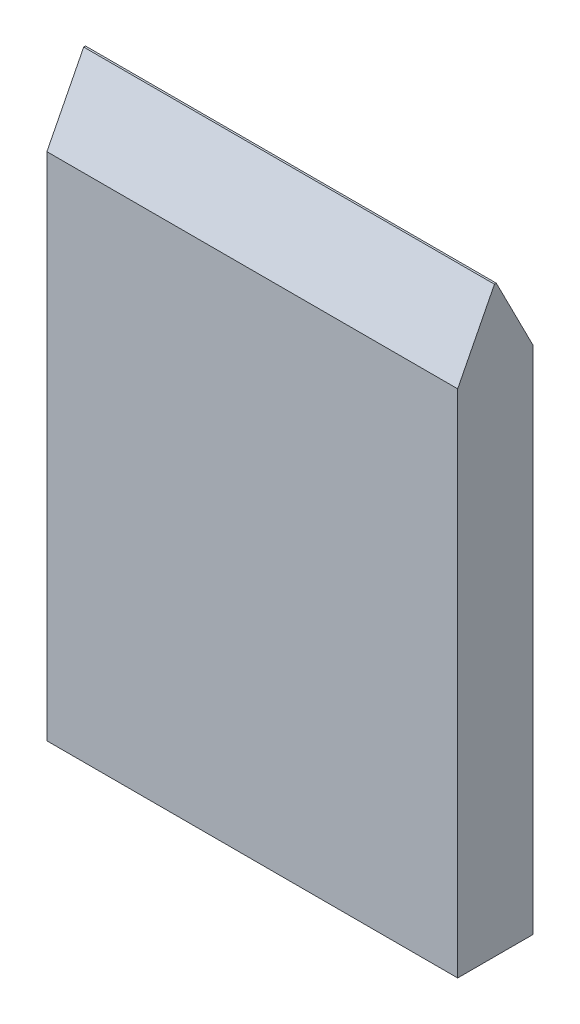
ISO-10303-21;
HEADER;
FILE_DESCRIPTION(('STEP AP214'),'2;1');
FILE_NAME('part.step','',(''),(''),'','','');
FILE_SCHEMA(('AUTOMOTIVE_DESIGN { 1 0 10303 214 1 1 1 1 }'));
ENDSEC;
DATA;
#1=APPLICATION_CONTEXT('core data for automotive mechanical design processes');
#2=APPLICATION_PROTOCOL_DEFINITION('international standard','automotive_design',2000,#1);
#3=PRODUCT_CONTEXT('',#1,'mechanical');
#4=PRODUCT('Part','Part','',(#3));
#5=PRODUCT_RELATED_PRODUCT_CATEGORY('part','',(#4));
#6=PRODUCT_DEFINITION_FORMATION('','',#4);
#7=PRODUCT_DEFINITION_CONTEXT('part definition',#1,'design');
#8=PRODUCT_DEFINITION('design','',#6,#7);
#9=PRODUCT_DEFINITION_SHAPE('','',#8);
#10=(LENGTH_UNIT() NAMED_UNIT(*) SI_UNIT(.MILLI.,.METRE.));
#11=(NAMED_UNIT(*) PLANE_ANGLE_UNIT() SI_UNIT($,.RADIAN.));
#12=(NAMED_UNIT(*) SI_UNIT($,.STERADIAN.) SOLID_ANGLE_UNIT());
#13=UNCERTAINTY_MEASURE_WITH_UNIT(LENGTH_MEASURE(1.E-05),#10,'distance_accuracy_value','');
#14=(GEOMETRIC_REPRESENTATION_CONTEXT(3) GLOBAL_UNCERTAINTY_ASSIGNED_CONTEXT((#13)) GLOBAL_UNIT_ASSIGNED_CONTEXT((#10,
#11,#12)) REPRESENTATION_CONTEXT('',''));
#15=CARTESIAN_POINT('',(0.,0.,0.));
#16=DIRECTION('',(0.,0.,1.));
#17=DIRECTION('',(1.,0.,0.));
#18=AXIS2_PLACEMENT_3D('',#15,#16,#17);
#19=CARTESIAN_POINT('',(-3.35,-4.75,1.23));
#20=DIRECTION('',(1.,0.,0.));
#21=DIRECTION('',(0.,0.,-1.));
#22=AXIS2_PLACEMENT_3D('',#19,#20,#21);
#23=PLANE('',#22);
#24=DIRECTION('',(0.,0.,-1.));
#25=VECTOR('',#24,1.);
#26=CARTESIAN_POINT('',(-3.35,4.75,1.23));
#27=LINE('',#26,#25);
#28=CARTESIAN_POINT('',(-3.35,4.75,0.629999999999999));
#29=VERTEX_POINT('',#28);
#30=CARTESIAN_POINT('',(-3.35,4.75,0.600000000000002));
#31=VERTEX_POINT('',#30);
#32=EDGE_CURVE('E171',#29,#31,#27,.T.);
#33=ORIENTED_EDGE('',*,*,#32,.T.);
#34=DIRECTION('',(0.,0.891006524188368,0.453990499739547));
#35=VECTOR('',#34,1.);
#36=CARTESIAN_POINT('',(-3.35,4.75,0.600000000000002));
#37=LINE('',#36,#35);
#38=CARTESIAN_POINT('',(-3.35,3.57243369669691,0.));
#39=VERTEX_POINT('',#38);
#40=EDGE_CURVE('E153',#31,#39,#37,.F.);
#41=ORIENTED_EDGE('',*,*,#40,.T.);
#42=DIRECTION('',(0.,-1.,0.));
#43=VECTOR('',#42,1.);
#44=CARTESIAN_POINT('',(-3.35,-4.75,0.));
#45=LINE('',#44,#43);
#46=CARTESIAN_POINT('',(-3.35,-4.75,0.));
#47=VERTEX_POINT('',#46);
#48=EDGE_CURVE('E133',#39,#47,#45,.T.);
#49=ORIENTED_EDGE('',*,*,#48,.T.);
#50=DIRECTION('',(0.,0.,-1.));
#51=VECTOR('',#50,1.);
#52=CARTESIAN_POINT('',(-3.35,-4.75,1.23));
#53=LINE('',#52,#51);
#54=CARTESIAN_POINT('',(-3.35,-4.75,1.23));
#55=VERTEX_POINT('',#54);
#56=EDGE_CURVE('E126',#55,#47,#53,.T.);
#57=ORIENTED_EDGE('',*,*,#56,.F.);
#58=DIRECTION('',(0.,-1.,0.));
#59=VECTOR('',#58,1.);
#60=CARTESIAN_POINT('',(-3.35,-4.75,1.23));
#61=LINE('',#60,#59);
#62=CARTESIAN_POINT('',(-3.35,3.57243369669691,1.23));
#63=VERTEX_POINT('',#62);
#64=EDGE_CURVE('E112',#63,#55,#61,.T.);
#65=ORIENTED_EDGE('',*,*,#64,.F.);
#66=DIRECTION('',(0.,0.891006524188368,-0.453990499739547));
#67=VECTOR('',#66,1.);
#68=CARTESIAN_POINT('',(-3.35,3.57243369669691,1.23));
#69=LINE('',#68,#67);
#70=EDGE_CURVE('E150',#63,#29,#69,.T.);
#71=ORIENTED_EDGE('',*,*,#70,.T.);
#72=EDGE_LOOP('',(#33,#41,#49,#57,#65,#71));
#73=FACE_BOUND('',#72,.T.);
#74=ADVANCED_FACE('F43',(#73),#23,.F.);
#75=CARTESIAN_POINT('',(3.35,-4.75,1.23));
#76=DIRECTION('',(0.,1.,0.));
#77=DIRECTION('',(-1.,0.,0.));
#78=AXIS2_PLACEMENT_3D('',#75,#76,#77);
#79=PLANE('',#78);
#80=DIRECTION('',(1.,0.,0.));
#81=VECTOR('',#80,1.);
#82=CARTESIAN_POINT('',(3.35,-4.75,0.));
#83=LINE('',#82,#81);
#84=CARTESIAN_POINT('',(3.35,-4.75,0.));
#85=VERTEX_POINT('',#84);
#86=EDGE_CURVE('E174',#47,#85,#83,.T.);
#87=ORIENTED_EDGE('',*,*,#86,.T.);
#88=DIRECTION('',(0.,0.,-1.));
#89=VECTOR('',#88,1.);
#90=CARTESIAN_POINT('',(3.35,-4.75,1.23));
#91=LINE('',#90,#89);
#92=CARTESIAN_POINT('',(3.35,-4.75,1.23));
#93=VERTEX_POINT('',#92);
#94=EDGE_CURVE('E128',#93,#85,#91,.T.);
#95=ORIENTED_EDGE('',*,*,#94,.F.);
#96=DIRECTION('',(1.,0.,0.));
#97=VECTOR('',#96,1.);
#98=CARTESIAN_POINT('',(3.35,-4.75,1.23));
#99=LINE('',#98,#97);
#100=EDGE_CURVE('E115',#55,#93,#99,.T.);
#101=ORIENTED_EDGE('',*,*,#100,.F.);
#102=ORIENTED_EDGE('',*,*,#56,.T.);
#103=EDGE_LOOP('',(#87,#95,#101,#102));
#104=FACE_BOUND('',#103,.T.);
#105=ADVANCED_FACE('F125',(#104),#79,.F.);
#106=CARTESIAN_POINT('',(3.35,-4.75,1.23));
#107=DIRECTION('',(-1.,0.,0.));
#108=DIRECTION('',(0.,0.,1.));
#109=AXIS2_PLACEMENT_3D('',#106,#107,#108);
#110=PLANE('',#109);
#111=DIRECTION('',(0.,1.,0.));
#112=VECTOR('',#111,1.);
#113=CARTESIAN_POINT('',(3.35,-4.75,0.));
#114=LINE('',#113,#112);
#115=CARTESIAN_POINT('',(3.35,3.57243369669691,0.));
#116=VERTEX_POINT('',#115);
#117=EDGE_CURVE('E121',#85,#116,#114,.T.);
#118=ORIENTED_EDGE('',*,*,#117,.T.);
#119=DIRECTION('',(0.,-0.891006524188368,-0.453990499739547));
#120=VECTOR('',#119,1.);
#121=CARTESIAN_POINT('',(3.35,4.75,0.600000000000002));
#122=LINE('',#121,#120);
#123=CARTESIAN_POINT('',(3.35,4.75,0.600000000000002));
#124=VERTEX_POINT('',#123);
#125=EDGE_CURVE('E52',#116,#124,#122,.F.);
#126=ORIENTED_EDGE('',*,*,#125,.T.);
#127=DIRECTION('',(0.,0.,-1.));
#128=VECTOR('',#127,1.);
#129=CARTESIAN_POINT('',(3.35,4.75,1.23));
#130=LINE('',#129,#128);
#131=CARTESIAN_POINT('',(3.35,4.75,0.629999999999999));
#132=VERTEX_POINT('',#131);
#133=EDGE_CURVE('E143',#132,#124,#130,.T.);
#134=ORIENTED_EDGE('',*,*,#133,.F.);
#135=DIRECTION('',(0.,-0.891006524188368,0.453990499739547));
#136=VECTOR('',#135,1.);
#137=CARTESIAN_POINT('',(3.35,3.57243369669691,1.23));
#138=LINE('',#137,#136);
#139=CARTESIAN_POINT('',(3.35,3.57243369669691,1.23));
#140=VERTEX_POINT('',#139);
#141=EDGE_CURVE('E62',#132,#140,#138,.T.);
#142=ORIENTED_EDGE('',*,*,#141,.T.);
#143=DIRECTION('',(0.,1.,0.));
#144=VECTOR('',#143,1.);
#145=CARTESIAN_POINT('',(3.35,-4.75,1.23));
#146=LINE('',#145,#144);
#147=EDGE_CURVE('E130',#93,#140,#146,.T.);
#148=ORIENTED_EDGE('',*,*,#147,.F.);
#149=ORIENTED_EDGE('',*,*,#94,.T.);
#150=EDGE_LOOP('',(#118,#126,#134,#142,#148,#149));
#151=FACE_BOUND('',#150,.T.);
#152=ADVANCED_FACE('F163',(#151),#110,.F.);
#153=CARTESIAN_POINT('',(3.35,4.75,1.23));
#154=DIRECTION('',(0.,-1.,0.));
#155=DIRECTION('',(1.,0.,0.));
#156=AXIS2_PLACEMENT_3D('',#153,#154,#155);
#157=PLANE('',#156);
#158=ORIENTED_EDGE('',*,*,#133,.T.);
#159=DIRECTION('',(-1.,0.,0.));
#160=VECTOR('',#159,1.);
#161=CARTESIAN_POINT('',(3.35,4.75,0.600000000000002));
#162=LINE('',#161,#160);
#163=EDGE_CURVE('E140',#124,#31,#162,.T.);
#164=ORIENTED_EDGE('',*,*,#163,.T.);
#165=ORIENTED_EDGE('',*,*,#32,.F.);
#166=DIRECTION('',(1.,0.,0.));
#167=VECTOR('',#166,1.);
#168=CARTESIAN_POINT('',(3.35,4.75,0.629999999999999));
#169=LINE('',#168,#167);
#170=EDGE_CURVE('E136',#29,#132,#169,.T.);
#171=ORIENTED_EDGE('',*,*,#170,.T.);
#172=EDGE_LOOP('',(#158,#164,#165,#171));
#173=FACE_BOUND('',#172,.T.);
#174=ADVANCED_FACE('F167',(#173),#157,.F.);
#175=CARTESIAN_POINT('',(0.,0.,1.23));
#176=DIRECTION('',(0.,0.,1.));
#177=DIRECTION('',(1.,0.,0.));
#178=AXIS2_PLACEMENT_3D('',#175,#176,#177);
#179=PLANE('',#178);
#180=ORIENTED_EDGE('',*,*,#147,.T.);
#181=DIRECTION('',(-1.,0.,0.));
#182=VECTOR('',#181,1.);
#183=CARTESIAN_POINT('',(-3.35,3.57243369669691,1.23));
#184=LINE('',#183,#182);
#185=EDGE_CURVE('E11',#140,#63,#184,.T.);
#186=ORIENTED_EDGE('',*,*,#185,.T.);
#187=ORIENTED_EDGE('',*,*,#64,.T.);
#188=ORIENTED_EDGE('',*,*,#100,.T.);
#189=EDGE_LOOP('',(#180,#186,#187,#188));
#190=FACE_BOUND('',#189,.T.);
#191=ADVANCED_FACE('F114',(#190),#179,.T.);
#192=CARTESIAN_POINT('',(0.,0.,0.));
#193=DIRECTION('',(0.,0.,1.));
#194=DIRECTION('',(1.,0.,0.));
#195=AXIS2_PLACEMENT_3D('',#192,#193,#194);
#196=PLANE('',#195);
#197=ORIENTED_EDGE('',*,*,#48,.F.);
#198=DIRECTION('',(1.,0.,0.));
#199=VECTOR('',#198,1.);
#200=CARTESIAN_POINT('',(0.,3.57243369669691,0.));
#201=LINE('',#200,#199);
#202=EDGE_CURVE('E72',#39,#116,#201,.T.);
#203=ORIENTED_EDGE('',*,*,#202,.T.);
#204=ORIENTED_EDGE('',*,*,#117,.F.);
#205=ORIENTED_EDGE('',*,*,#86,.F.);
#206=EDGE_LOOP('',(#197,#203,#204,#205));
#207=FACE_BOUND('',#206,.T.);
#208=ADVANCED_FACE('F173',(#207),#196,.F.);
#209=CARTESIAN_POINT('',(3.35,4.75,0.600000000000002));
#210=DIRECTION('',(0.,-0.453990499739547,0.891006524188368));
#211=DIRECTION('',(-1.,0.,0.));
#212=AXIS2_PLACEMENT_3D('',#209,#210,#211);
#213=PLANE('',#212);
#214=ORIENTED_EDGE('',*,*,#125,.F.);
#215=ORIENTED_EDGE('',*,*,#202,.F.);
#216=ORIENTED_EDGE('',*,*,#40,.F.);
#217=ORIENTED_EDGE('',*,*,#163,.F.);
#218=EDGE_LOOP('',(#214,#215,#216,#217));
#219=FACE_BOUND('',#218,.T.);
#220=ADVANCED_FACE('F172',(#219),#213,.F.);
#221=CARTESIAN_POINT('',(0.,3.57243369669691,1.23));
#222=DIRECTION('',(0.,0.453990499739547,0.891006524188368));
#223=DIRECTION('',(1.,0.,0.));
#224=AXIS2_PLACEMENT_3D('',#221,#222,#223);
#225=PLANE('',#224);
#226=ORIENTED_EDGE('',*,*,#141,.F.);
#227=ORIENTED_EDGE('',*,*,#170,.F.);
#228=ORIENTED_EDGE('',*,*,#70,.F.);
#229=ORIENTED_EDGE('',*,*,#185,.F.);
#230=EDGE_LOOP('',(#226,#227,#228,#229));
#231=FACE_BOUND('',#230,.T.);
#232=ADVANCED_FACE('F45',(#231),#225,.T.);
#233=CLOSED_SHELL('',(#74,#105,#152,#174,#191,#208,#220,#232));
#234=MANIFOLD_SOLID_BREP('B2',#233);
#235=ADVANCED_BREP_SHAPE_REPRESENTATION('',(#18,#234),#14);
#236=SHAPE_DEFINITION_REPRESENTATION(#9,#235);
ENDSEC;
END-ISO-10303-21;
